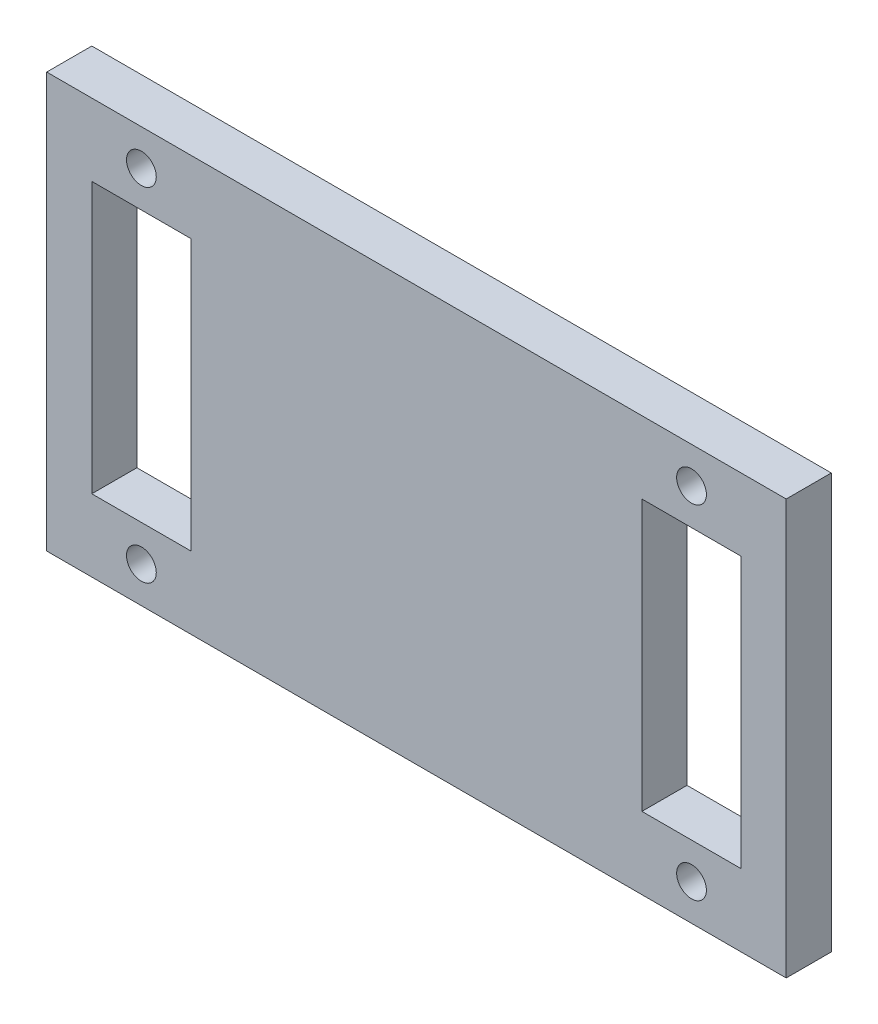
ISO-10303-21;
HEADER;
FILE_DESCRIPTION(('STEP AP214'),'2;1');
FILE_NAME('part.step','',(''),(''),'','','');
FILE_SCHEMA(('AUTOMOTIVE_DESIGN { 1 0 10303 214 1 1 1 1 }'));
ENDSEC;
DATA;
#1=APPLICATION_CONTEXT('core data for automotive mechanical design processes');
#2=APPLICATION_PROTOCOL_DEFINITION('international standard','automotive_design',2000,#1);
#3=PRODUCT_CONTEXT('',#1,'mechanical');
#4=PRODUCT('Part','Part','',(#3));
#5=PRODUCT_RELATED_PRODUCT_CATEGORY('part','',(#4));
#6=PRODUCT_DEFINITION_FORMATION('','',#4);
#7=PRODUCT_DEFINITION_CONTEXT('part definition',#1,'design');
#8=PRODUCT_DEFINITION('design','',#6,#7);
#9=PRODUCT_DEFINITION_SHAPE('','',#8);
#10=(LENGTH_UNIT() NAMED_UNIT(*) SI_UNIT(.MILLI.,.METRE.));
#11=(NAMED_UNIT(*) PLANE_ANGLE_UNIT() SI_UNIT($,.RADIAN.));
#12=(NAMED_UNIT(*) SI_UNIT($,.STERADIAN.) SOLID_ANGLE_UNIT());
#13=UNCERTAINTY_MEASURE_WITH_UNIT(LENGTH_MEASURE(1.E-05),#10,'distance_accuracy_value','');
#14=(GEOMETRIC_REPRESENTATION_CONTEXT(3) GLOBAL_UNCERTAINTY_ASSIGNED_CONTEXT((#13)) GLOBAL_UNIT_ASSIGNED_CONTEXT((#10,
#11,#12)) REPRESENTATION_CONTEXT('',''));
#15=CARTESIAN_POINT('',(0.,0.,0.));
#16=DIRECTION('',(0.,0.,1.));
#17=DIRECTION('',(1.,0.,0.));
#18=AXIS2_PLACEMENT_3D('',#15,#16,#17);
#19=CARTESIAN_POINT('',(0.,0.,5.));
#20=DIRECTION('',(0.,0.,1.));
#21=DIRECTION('',(1.,0.,0.));
#22=AXIS2_PLACEMENT_3D('',#19,#20,#21);
#23=PLANE('',#22);
#24=CARTESIAN_POINT('',(-71.4999999999936,40.9109694945555,5.));
#25=DIRECTION('',(0.,0.,1.));
#26=DIRECTION('',(1.,0.,0.));
#27=AXIS2_PLACEMENT_3D('',#24,#25,#26);
#28=CIRCLE('',#27,1.64999999999651);
#29=CARTESIAN_POINT('',(-69.8499999999972,40.9109694945555,5.));
#30=VERTEX_POINT('',#29);
#31=EDGE_CURVE('E195',#30,#30,#28,.T.);
#32=ORIENTED_EDGE('',*,*,#31,.F.);
#33=EDGE_LOOP('',(#32));
#34=FACE_BOUND('',#33,.T.);
#35=CARTESIAN_POINT('',(-10.4999999999979,40.9109694945554,5.));
#36=DIRECTION('',(0.,0.,1.));
#37=DIRECTION('',(1.,0.,0.));
#38=AXIS2_PLACEMENT_3D('',#35,#36,#37);
#39=CIRCLE('',#38,1.64999999999576);
#40=CARTESIAN_POINT('',(-8.85000000000211,40.9109694945554,5.));
#41=VERTEX_POINT('',#40);
#42=EDGE_CURVE('E207',#41,#41,#39,.T.);
#43=ORIENTED_EDGE('',*,*,#42,.F.);
#44=EDGE_LOOP('',(#43));
#45=FACE_BOUND('',#44,.T.);
#46=DIRECTION('',(0.,-1.,0.));
#47=VECTOR('',#46,1.);
#48=CARTESIAN_POINT('',(-81.9999999999916,82.9109694945566,5.));
#49=LINE('',#48,#47);
#50=CARTESIAN_POINT('',(-81.9999999999916,82.9109694945566,5.));
#51=VERTEX_POINT('',#50);
#52=CARTESIAN_POINT('',(-81.9999999999916,36.9109694945566,5.));
#53=VERTEX_POINT('',#52);
#54=EDGE_CURVE('E213',#51,#53,#49,.T.);
#55=ORIENTED_EDGE('',*,*,#54,.T.);
#56=DIRECTION('',(1.,0.,0.));
#57=VECTOR('',#56,1.);
#58=CARTESIAN_POINT('',(-81.9999999999916,36.9109694945566,5.));
#59=LINE('',#58,#57);
#60=CARTESIAN_POINT('',(0.,36.9109694945566,5.));
#61=VERTEX_POINT('',#60);
#62=EDGE_CURVE('E216',#53,#61,#59,.T.);
#63=ORIENTED_EDGE('',*,*,#62,.T.);
#64=DIRECTION('',(0.,1.,0.));
#65=VECTOR('',#64,1.);
#66=CARTESIAN_POINT('',(0.,82.9109694945566,5.));
#67=LINE('',#66,#65);
#68=CARTESIAN_POINT('',(0.,82.9109694945566,5.));
#69=VERTEX_POINT('',#68);
#70=EDGE_CURVE('E219',#61,#69,#67,.T.);
#71=ORIENTED_EDGE('',*,*,#70,.T.);
#72=DIRECTION('',(-1.,0.,0.));
#73=VECTOR('',#72,1.);
#74=CARTESIAN_POINT('',(-81.9999999999916,82.9109694945566,5.));
#75=LINE('',#74,#73);
#76=EDGE_CURVE('E221',#69,#51,#75,.T.);
#77=ORIENTED_EDGE('',*,*,#76,.T.);
#78=EDGE_LOOP('',(#55,#63,#71,#77));
#79=FACE_BOUND('',#78,.T.);
#80=CARTESIAN_POINT('',(-10.4999999999979,78.9109694945554,5.));
#81=DIRECTION('',(0.,0.,1.));
#82=DIRECTION('',(1.,0.,0.));
#83=AXIS2_PLACEMENT_3D('',#80,#81,#82);
#84=CIRCLE('',#83,1.64999999999576);
#85=CARTESIAN_POINT('',(-8.85000000000217,78.9109694945554,5.));
#86=VERTEX_POINT('',#85);
#87=EDGE_CURVE('E201',#86,#86,#84,.T.);
#88=ORIENTED_EDGE('',*,*,#87,.F.);
#89=EDGE_LOOP('',(#88));
#90=FACE_BOUND('',#89,.T.);
#91=CARTESIAN_POINT('',(-71.4999999999937,78.9109694945555,5.));
#92=DIRECTION('',(0.,0.,1.));
#93=DIRECTION('',(1.,0.,0.));
#94=AXIS2_PLACEMENT_3D('',#91,#92,#93);
#95=CIRCLE('',#94,1.6499999999965);
#96=CARTESIAN_POINT('',(-69.8499999999972,78.9109694945555,5.));
#97=VERTEX_POINT('',#96);
#98=EDGE_CURVE('E189',#97,#97,#95,.T.);
#99=ORIENTED_EDGE('',*,*,#98,.F.);
#100=EDGE_LOOP('',(#99));
#101=FACE_BOUND('',#100,.T.);
#102=DIRECTION('',(-1.,0.,0.));
#103=VECTOR('',#102,1.);
#104=CARTESIAN_POINT('',(-65.9999999999958,74.9109694945545,5.));
#105=LINE('',#104,#103);
#106=CARTESIAN_POINT('',(-65.9999999999958,74.9109694945545,5.));
#107=VERTEX_POINT('',#106);
#108=CARTESIAN_POINT('',(-76.9999999999916,74.9109694945545,5.));
#109=VERTEX_POINT('',#108);
#110=EDGE_CURVE('E160',#107,#109,#105,.T.);
#111=ORIENTED_EDGE('',*,*,#110,.F.);
#112=DIRECTION('',(0.,1.,0.));
#113=VECTOR('',#112,1.);
#114=CARTESIAN_POINT('',(-65.9999999999958,44.9109694945565,5.));
#115=LINE('',#114,#113);
#116=CARTESIAN_POINT('',(-65.9999999999958,44.9109694945565,5.));
#117=VERTEX_POINT('',#116);
#118=EDGE_CURVE('E158',#117,#107,#115,.T.);
#119=ORIENTED_EDGE('',*,*,#118,.F.);
#120=DIRECTION('',(1.,0.,0.));
#121=VECTOR('',#120,1.);
#122=CARTESIAN_POINT('',(-65.9999999999958,44.9109694945565,5.));
#123=LINE('',#122,#121);
#124=CARTESIAN_POINT('',(-76.9999999999916,44.9109694945565,5.));
#125=VERTEX_POINT('',#124);
#126=EDGE_CURVE('E166',#125,#117,#123,.T.);
#127=ORIENTED_EDGE('',*,*,#126,.F.);
#128=DIRECTION('',(0.,-1.,0.));
#129=VECTOR('',#128,1.);
#130=CARTESIAN_POINT('',(-76.9999999999916,44.9109694945565,5.));
#131=LINE('',#130,#129);
#132=EDGE_CURVE('E163',#109,#125,#131,.T.);
#133=ORIENTED_EDGE('',*,*,#132,.F.);
#134=EDGE_LOOP('',(#111,#119,#127,#133));
#135=FACE_BOUND('',#134,.T.);
#136=DIRECTION('',(1.,0.,0.));
#137=VECTOR('',#136,1.);
#138=CARTESIAN_POINT('',(-15.9999999999958,44.9109694945563,5.));
#139=LINE('',#138,#137);
#140=CARTESIAN_POINT('',(-15.9999999999958,44.9109694945563,5.));
#141=VERTEX_POINT('',#140);
#142=CARTESIAN_POINT('',(-5.00000000000003,44.9109694945563,5.));
#143=VERTEX_POINT('',#142);
#144=EDGE_CURVE('E130',#141,#143,#139,.T.);
#145=ORIENTED_EDGE('',*,*,#144,.F.);
#146=DIRECTION('',(0.,-1.,0.));
#147=VECTOR('',#146,1.);
#148=CARTESIAN_POINT('',(-15.9999999999958,44.9109694945563,5.));
#149=LINE('',#148,#147);
#150=CARTESIAN_POINT('',(-15.9999999999958,74.9109694945545,5.));
#151=VERTEX_POINT('',#150);
#152=EDGE_CURVE('E122',#151,#141,#149,.T.);
#153=ORIENTED_EDGE('',*,*,#152,.F.);
#154=DIRECTION('',(-1.,0.,0.));
#155=VECTOR('',#154,1.);
#156=CARTESIAN_POINT('',(-15.9999999999958,74.9109694945545,5.));
#157=LINE('',#156,#155);
#158=CARTESIAN_POINT('',(-5.00000000000003,74.9109694945545,5.));
#159=VERTEX_POINT('',#158);
#160=EDGE_CURVE('E144',#159,#151,#157,.T.);
#161=ORIENTED_EDGE('',*,*,#160,.F.);
#162=DIRECTION('',(0.,1.,0.));
#163=VECTOR('',#162,1.);
#164=CARTESIAN_POINT('',(-5.00000000000003,44.9109694945563,5.));
#165=LINE('',#164,#163);
#166=EDGE_CURVE('E142',#143,#159,#165,.T.);
#167=ORIENTED_EDGE('',*,*,#166,.F.);
#168=EDGE_LOOP('',(#145,#153,#161,#167));
#169=FACE_BOUND('',#168,.T.);
#170=ADVANCED_FACE('F33',(#34,#45,#79,#90,#101,#135,#169),#23,.T.);
#171=CARTESIAN_POINT('',(0.,0.,0.));
#172=DIRECTION('',(0.,0.,1.));
#173=DIRECTION('',(1.,0.,0.));
#174=AXIS2_PLACEMENT_3D('',#171,#172,#173);
#175=PLANE('',#174);
#176=DIRECTION('',(0.,1.,0.));
#177=VECTOR('',#176,1.);
#178=CARTESIAN_POINT('',(-65.9999999999958,44.9109694945565,0.));
#179=LINE('',#178,#177);
#180=CARTESIAN_POINT('',(-65.9999999999958,44.9109694945565,0.));
#181=VERTEX_POINT('',#180);
#182=CARTESIAN_POINT('',(-65.9999999999958,74.9109694945545,0.));
#183=VERTEX_POINT('',#182);
#184=EDGE_CURVE('E138',#181,#183,#179,.T.);
#185=ORIENTED_EDGE('',*,*,#184,.T.);
#186=DIRECTION('',(-1.,0.,0.));
#187=VECTOR('',#186,1.);
#188=CARTESIAN_POINT('',(-65.9999999999958,74.9109694945545,0.));
#189=LINE('',#188,#187);
#190=CARTESIAN_POINT('',(-76.9999999999916,74.9109694945545,0.));
#191=VERTEX_POINT('',#190);
#192=EDGE_CURVE('E171',#183,#191,#189,.T.);
#193=ORIENTED_EDGE('',*,*,#192,.T.);
#194=DIRECTION('',(0.,-1.,0.));
#195=VECTOR('',#194,1.);
#196=CARTESIAN_POINT('',(-76.9999999999916,44.9109694945565,0.));
#197=LINE('',#196,#195);
#198=CARTESIAN_POINT('',(-76.9999999999916,44.9109694945565,0.));
#199=VERTEX_POINT('',#198);
#200=EDGE_CURVE('E174',#191,#199,#197,.T.);
#201=ORIENTED_EDGE('',*,*,#200,.T.);
#202=DIRECTION('',(1.,0.,0.));
#203=VECTOR('',#202,1.);
#204=CARTESIAN_POINT('',(-65.9999999999958,44.9109694945565,0.));
#205=LINE('',#204,#203);
#206=EDGE_CURVE('E161',#199,#181,#205,.T.);
#207=ORIENTED_EDGE('',*,*,#206,.T.);
#208=EDGE_LOOP('',(#185,#193,#201,#207));
#209=FACE_BOUND('',#208,.T.);
#210=DIRECTION('',(0.,-1.,0.));
#211=VECTOR('',#210,1.);
#212=CARTESIAN_POINT('',(-81.9999999999916,82.9109694945566,0.));
#213=LINE('',#212,#211);
#214=CARTESIAN_POINT('',(-81.9999999999916,82.9109694945566,0.));
#215=VERTEX_POINT('',#214);
#216=CARTESIAN_POINT('',(-81.9999999999916,36.9109694945566,0.));
#217=VERTEX_POINT('',#216);
#218=EDGE_CURVE('E210',#215,#217,#213,.T.);
#219=ORIENTED_EDGE('',*,*,#218,.F.);
#220=DIRECTION('',(-1.,0.,0.));
#221=VECTOR('',#220,1.);
#222=CARTESIAN_POINT('',(-81.9999999999916,82.9109694945566,0.));
#223=LINE('',#222,#221);
#224=CARTESIAN_POINT('',(0.,82.9109694945566,0.));
#225=VERTEX_POINT('',#224);
#226=EDGE_CURVE('E217',#225,#215,#223,.T.);
#227=ORIENTED_EDGE('',*,*,#226,.F.);
#228=DIRECTION('',(0.,1.,0.));
#229=VECTOR('',#228,1.);
#230=CARTESIAN_POINT('',(0.,82.9109694945566,0.));
#231=LINE('',#230,#229);
#232=CARTESIAN_POINT('',(0.,36.9109694945566,0.));
#233=VERTEX_POINT('',#232);
#234=EDGE_CURVE('E228',#233,#225,#231,.T.);
#235=ORIENTED_EDGE('',*,*,#234,.F.);
#236=DIRECTION('',(1.,0.,0.));
#237=VECTOR('',#236,1.);
#238=CARTESIAN_POINT('',(-81.9999999999916,36.9109694945566,0.));
#239=LINE('',#238,#237);
#240=EDGE_CURVE('E226',#217,#233,#239,.T.);
#241=ORIENTED_EDGE('',*,*,#240,.F.);
#242=EDGE_LOOP('',(#219,#227,#235,#241));
#243=FACE_BOUND('',#242,.T.);
#244=CARTESIAN_POINT('',(-10.4999999999979,40.9109694945554,0.));
#245=DIRECTION('',(0.,0.,1.));
#246=DIRECTION('',(1.,0.,0.));
#247=AXIS2_PLACEMENT_3D('',#244,#245,#246);
#248=CIRCLE('',#247,1.64999999999576);
#249=CARTESIAN_POINT('',(-8.85000000000211,40.9109694945554,0.));
#250=VERTEX_POINT('',#249);
#251=EDGE_CURVE('E204',#250,#250,#248,.T.);
#252=ORIENTED_EDGE('',*,*,#251,.T.);
#253=EDGE_LOOP('',(#252));
#254=FACE_BOUND('',#253,.T.);
#255=CARTESIAN_POINT('',(-10.4999999999979,78.9109694945554,0.));
#256=DIRECTION('',(0.,0.,1.));
#257=DIRECTION('',(1.,0.,0.));
#258=AXIS2_PLACEMENT_3D('',#255,#256,#257);
#259=CIRCLE('',#258,1.64999999999576);
#260=CARTESIAN_POINT('',(-8.85000000000217,78.9109694945554,0.));
#261=VERTEX_POINT('',#260);
#262=EDGE_CURVE('E198',#261,#261,#259,.T.);
#263=ORIENTED_EDGE('',*,*,#262,.T.);
#264=EDGE_LOOP('',(#263));
#265=FACE_BOUND('',#264,.T.);
#266=CARTESIAN_POINT('',(-71.4999999999936,40.9109694945555,0.));
#267=DIRECTION('',(0.,0.,1.));
#268=DIRECTION('',(1.,0.,0.));
#269=AXIS2_PLACEMENT_3D('',#266,#267,#268);
#270=CIRCLE('',#269,1.64999999999651);
#271=CARTESIAN_POINT('',(-69.8499999999972,40.9109694945555,0.));
#272=VERTEX_POINT('',#271);
#273=EDGE_CURVE('E192',#272,#272,#270,.T.);
#274=ORIENTED_EDGE('',*,*,#273,.T.);
#275=EDGE_LOOP('',(#274));
#276=FACE_BOUND('',#275,.T.);
#277=CARTESIAN_POINT('',(-71.4999999999937,78.9109694945555,0.));
#278=DIRECTION('',(0.,0.,1.));
#279=DIRECTION('',(1.,0.,0.));
#280=AXIS2_PLACEMENT_3D('',#277,#278,#279);
#281=CIRCLE('',#280,1.6499999999965);
#282=CARTESIAN_POINT('',(-69.8499999999972,78.9109694945555,0.));
#283=VERTEX_POINT('',#282);
#284=EDGE_CURVE('E188',#283,#283,#281,.T.);
#285=ORIENTED_EDGE('',*,*,#284,.T.);
#286=EDGE_LOOP('',(#285));
#287=FACE_BOUND('',#286,.T.);
#288=DIRECTION('',(0.,-1.,0.));
#289=VECTOR('',#288,1.);
#290=CARTESIAN_POINT('',(-15.9999999999958,44.9109694945563,0.));
#291=LINE('',#290,#289);
#292=CARTESIAN_POINT('',(-15.9999999999958,74.9109694945545,0.));
#293=VERTEX_POINT('',#292);
#294=CARTESIAN_POINT('',(-15.9999999999958,44.9109694945563,0.));
#295=VERTEX_POINT('',#294);
#296=EDGE_CURVE('E56',#293,#295,#291,.T.);
#297=ORIENTED_EDGE('',*,*,#296,.T.);
#298=DIRECTION('',(1.,0.,0.));
#299=VECTOR('',#298,1.);
#300=CARTESIAN_POINT('',(-15.9999999999958,44.9109694945563,0.));
#301=LINE('',#300,#299);
#302=CARTESIAN_POINT('',(-5.00000000000003,44.9109694945563,0.));
#303=VERTEX_POINT('',#302);
#304=EDGE_CURVE('E137',#295,#303,#301,.T.);
#305=ORIENTED_EDGE('',*,*,#304,.T.);
#306=DIRECTION('',(0.,1.,0.));
#307=VECTOR('',#306,1.);
#308=CARTESIAN_POINT('',(-5.00000000000003,44.9109694945563,0.));
#309=LINE('',#308,#307);
#310=CARTESIAN_POINT('',(-5.00000000000003,74.9109694945545,0.));
#311=VERTEX_POINT('',#310);
#312=EDGE_CURVE('E150',#303,#311,#309,.T.);
#313=ORIENTED_EDGE('',*,*,#312,.T.);
#314=DIRECTION('',(-1.,0.,0.));
#315=VECTOR('',#314,1.);
#316=CARTESIAN_POINT('',(-15.9999999999958,74.9109694945545,0.));
#317=LINE('',#316,#315);
#318=EDGE_CURVE('E131',#311,#293,#317,.T.);
#319=ORIENTED_EDGE('',*,*,#318,.T.);
#320=EDGE_LOOP('',(#297,#305,#313,#319));
#321=FACE_BOUND('',#320,.T.);
#322=ADVANCED_FACE('F246',(#209,#243,#254,#265,#276,#287,#321),#175,.F.);
#323=CARTESIAN_POINT('',(-81.9999999999916,82.9109694945566,5.));
#324=DIRECTION('',(1.,0.,0.));
#325=DIRECTION('',(0.,0.,-1.));
#326=AXIS2_PLACEMENT_3D('',#323,#324,#325);
#327=PLANE('',#326);
#328=ORIENTED_EDGE('',*,*,#218,.T.);
#329=DIRECTION('',(0.,0.,-1.));
#330=VECTOR('',#329,1.);
#331=CARTESIAN_POINT('',(-81.9999999999916,36.9109694945566,5.));
#332=LINE('',#331,#330);
#333=EDGE_CURVE('E11',#53,#217,#332,.T.);
#334=ORIENTED_EDGE('',*,*,#333,.F.);
#335=ORIENTED_EDGE('',*,*,#54,.F.);
#336=DIRECTION('',(0.,0.,-1.));
#337=VECTOR('',#336,1.);
#338=CARTESIAN_POINT('',(-81.9999999999916,82.9109694945566,5.));
#339=LINE('',#338,#337);
#340=EDGE_CURVE('E223',#51,#215,#339,.T.);
#341=ORIENTED_EDGE('',*,*,#340,.T.);
#342=EDGE_LOOP('',(#328,#334,#335,#341));
#343=FACE_BOUND('',#342,.T.);
#344=ADVANCED_FACE('F35',(#343),#327,.F.);
#345=CARTESIAN_POINT('',(-81.9999999999916,36.9109694945566,5.));
#346=DIRECTION('',(0.,1.,0.));
#347=DIRECTION('',(0.,0.,1.));
#348=AXIS2_PLACEMENT_3D('',#345,#346,#347);
#349=PLANE('',#348);
#350=ORIENTED_EDGE('',*,*,#240,.T.);
#351=DIRECTION('',(0.,0.,-1.));
#352=VECTOR('',#351,1.);
#353=CARTESIAN_POINT('',(0.,36.9109694945566,5.));
#354=LINE('',#353,#352);
#355=EDGE_CURVE('E41',#61,#233,#354,.T.);
#356=ORIENTED_EDGE('',*,*,#355,.F.);
#357=ORIENTED_EDGE('',*,*,#62,.F.);
#358=ORIENTED_EDGE('',*,*,#333,.T.);
#359=EDGE_LOOP('',(#350,#356,#357,#358));
#360=FACE_BOUND('',#359,.T.);
#361=ADVANCED_FACE('F257',(#360),#349,.F.);
#362=CARTESIAN_POINT('',(0.,82.9109694945566,5.));
#363=DIRECTION('',(-1.,0.,0.));
#364=DIRECTION('',(0.,0.,1.));
#365=AXIS2_PLACEMENT_3D('',#362,#363,#364);
#366=PLANE('',#365);
#367=ORIENTED_EDGE('',*,*,#234,.T.);
#368=DIRECTION('',(0.,0.,-1.));
#369=VECTOR('',#368,1.);
#370=CARTESIAN_POINT('',(0.,82.9109694945566,5.));
#371=LINE('',#370,#369);
#372=EDGE_CURVE('E233',#69,#225,#371,.T.);
#373=ORIENTED_EDGE('',*,*,#372,.F.);
#374=ORIENTED_EDGE('',*,*,#70,.F.);
#375=ORIENTED_EDGE('',*,*,#355,.T.);
#376=EDGE_LOOP('',(#367,#373,#374,#375));
#377=FACE_BOUND('',#376,.T.);
#378=ADVANCED_FACE('F240',(#377),#366,.F.);
#379=CARTESIAN_POINT('',(-81.9999999999916,82.9109694945566,5.));
#380=DIRECTION('',(0.,-1.,0.));
#381=DIRECTION('',(0.,0.,-1.));
#382=AXIS2_PLACEMENT_3D('',#379,#380,#381);
#383=PLANE('',#382);
#384=ORIENTED_EDGE('',*,*,#226,.T.);
#385=ORIENTED_EDGE('',*,*,#340,.F.);
#386=ORIENTED_EDGE('',*,*,#76,.F.);
#387=ORIENTED_EDGE('',*,*,#372,.T.);
#388=EDGE_LOOP('',(#384,#385,#386,#387));
#389=FACE_BOUND('',#388,.T.);
#390=ADVANCED_FACE('F250',(#389),#383,.F.);
#391=CARTESIAN_POINT('',(-10.4999999999979,40.9109694945554,5.));
#392=DIRECTION('',(0.,0.,-1.));
#393=DIRECTION('',(-1.,0.,0.));
#394=AXIS2_PLACEMENT_3D('',#391,#392,#393);
#395=CYLINDRICAL_SURFACE('',#394,1.64999999999576);
#396=ORIENTED_EDGE('',*,*,#42,.T.);
#397=EDGE_LOOP('',(#396));
#398=FACE_BOUND('',#397,.T.);
#399=ORIENTED_EDGE('',*,*,#251,.F.);
#400=EDGE_LOOP('',(#399));
#401=FACE_BOUND('',#400,.T.);
#402=ADVANCED_FACE('F275',(#398,#401),#395,.F.);
#403=CARTESIAN_POINT('',(-10.4999999999979,78.9109694945554,5.));
#404=DIRECTION('',(0.,0.,-1.));
#405=DIRECTION('',(-1.,0.,0.));
#406=AXIS2_PLACEMENT_3D('',#403,#404,#405);
#407=CYLINDRICAL_SURFACE('',#406,1.64999999999576);
#408=ORIENTED_EDGE('',*,*,#87,.T.);
#409=EDGE_LOOP('',(#408));
#410=FACE_BOUND('',#409,.T.);
#411=ORIENTED_EDGE('',*,*,#262,.F.);
#412=EDGE_LOOP('',(#411));
#413=FACE_BOUND('',#412,.T.);
#414=ADVANCED_FACE('F282',(#410,#413),#407,.F.);
#415=CARTESIAN_POINT('',(-71.4999999999936,40.9109694945555,5.));
#416=DIRECTION('',(0.,0.,-1.));
#417=DIRECTION('',(-1.,0.,0.));
#418=AXIS2_PLACEMENT_3D('',#415,#416,#417);
#419=CYLINDRICAL_SURFACE('',#418,1.64999999999651);
#420=ORIENTED_EDGE('',*,*,#31,.T.);
#421=EDGE_LOOP('',(#420));
#422=FACE_BOUND('',#421,.T.);
#423=ORIENTED_EDGE('',*,*,#273,.F.);
#424=EDGE_LOOP('',(#423));
#425=FACE_BOUND('',#424,.T.);
#426=ADVANCED_FACE('F287',(#422,#425),#419,.F.);
#427=CARTESIAN_POINT('',(-71.4999999999937,78.9109694945555,5.));
#428=DIRECTION('',(0.,0.,-1.));
#429=DIRECTION('',(-1.,0.,0.));
#430=AXIS2_PLACEMENT_3D('',#427,#428,#429);
#431=CYLINDRICAL_SURFACE('',#430,1.6499999999965);
#432=ORIENTED_EDGE('',*,*,#98,.T.);
#433=EDGE_LOOP('',(#432));
#434=FACE_BOUND('',#433,.T.);
#435=ORIENTED_EDGE('',*,*,#284,.F.);
#436=EDGE_LOOP('',(#435));
#437=FACE_BOUND('',#436,.T.);
#438=ADVANCED_FACE('F329',(#434,#437),#431,.F.);
#439=CARTESIAN_POINT('',(-65.9999999999958,44.9109694945565,5.));
#440=DIRECTION('',(-1.,0.,0.));
#441=DIRECTION('',(0.,0.,1.));
#442=AXIS2_PLACEMENT_3D('',#439,#440,#441);
#443=PLANE('',#442);
#444=ORIENTED_EDGE('',*,*,#184,.F.);
#445=DIRECTION('',(0.,0.,-1.));
#446=VECTOR('',#445,1.);
#447=CARTESIAN_POINT('',(-65.9999999999958,44.9109694945565,5.));
#448=LINE('',#447,#446);
#449=EDGE_CURVE('E168',#117,#181,#448,.T.);
#450=ORIENTED_EDGE('',*,*,#449,.F.);
#451=ORIENTED_EDGE('',*,*,#118,.T.);
#452=DIRECTION('',(0.,0.,-1.));
#453=VECTOR('',#452,1.);
#454=CARTESIAN_POINT('',(-65.9999999999958,74.9109694945545,5.));
#455=LINE('',#454,#453);
#456=EDGE_CURVE('E185',#107,#183,#455,.T.);
#457=ORIENTED_EDGE('',*,*,#456,.T.);
#458=EDGE_LOOP('',(#444,#450,#451,#457));
#459=FACE_BOUND('',#458,.T.);
#460=ADVANCED_FACE('F325',(#459),#443,.T.);
#461=CARTESIAN_POINT('',(-65.9999999999958,74.9109694945545,5.));
#462=DIRECTION('',(0.,-1.,0.));
#463=DIRECTION('',(0.,0.,-1.));
#464=AXIS2_PLACEMENT_3D('',#461,#462,#463);
#465=PLANE('',#464);
#466=ORIENTED_EDGE('',*,*,#192,.F.);
#467=ORIENTED_EDGE('',*,*,#456,.F.);
#468=ORIENTED_EDGE('',*,*,#110,.T.);
#469=DIRECTION('',(0.,0.,-1.));
#470=VECTOR('',#469,1.);
#471=CARTESIAN_POINT('',(-76.9999999999916,74.9109694945545,5.));
#472=LINE('',#471,#470);
#473=EDGE_CURVE('E183',#109,#191,#472,.T.);
#474=ORIENTED_EDGE('',*,*,#473,.T.);
#475=EDGE_LOOP('',(#466,#467,#468,#474));
#476=FACE_BOUND('',#475,.T.);
#477=ADVANCED_FACE('F321',(#476),#465,.T.);
#478=CARTESIAN_POINT('',(-76.9999999999916,44.9109694945565,5.));
#479=DIRECTION('',(1.,0.,0.));
#480=DIRECTION('',(0.,0.,-1.));
#481=AXIS2_PLACEMENT_3D('',#478,#479,#480);
#482=PLANE('',#481);
#483=ORIENTED_EDGE('',*,*,#200,.F.);
#484=ORIENTED_EDGE('',*,*,#473,.F.);
#485=ORIENTED_EDGE('',*,*,#132,.T.);
#486=DIRECTION('',(0.,0.,-1.));
#487=VECTOR('',#486,1.);
#488=CARTESIAN_POINT('',(-76.9999999999916,44.9109694945565,5.));
#489=LINE('',#488,#487);
#490=EDGE_CURVE('E181',#125,#199,#489,.T.);
#491=ORIENTED_EDGE('',*,*,#490,.T.);
#492=EDGE_LOOP('',(#483,#484,#485,#491));
#493=FACE_BOUND('',#492,.T.);
#494=ADVANCED_FACE('F317',(#493),#482,.T.);
#495=CARTESIAN_POINT('',(-65.9999999999958,44.9109694945565,5.));
#496=DIRECTION('',(0.,1.,0.));
#497=DIRECTION('',(0.,0.,1.));
#498=AXIS2_PLACEMENT_3D('',#495,#496,#497);
#499=PLANE('',#498);
#500=ORIENTED_EDGE('',*,*,#206,.F.);
#501=ORIENTED_EDGE('',*,*,#490,.F.);
#502=ORIENTED_EDGE('',*,*,#126,.T.);
#503=ORIENTED_EDGE('',*,*,#449,.T.);
#504=EDGE_LOOP('',(#500,#501,#502,#503));
#505=FACE_BOUND('',#504,.T.);
#506=ADVANCED_FACE('F314',(#505),#499,.T.);
#507=CARTESIAN_POINT('',(-15.9999999999958,44.9109694945563,5.));
#508=DIRECTION('',(1.,0.,0.));
#509=DIRECTION('',(0.,0.,-1.));
#510=AXIS2_PLACEMENT_3D('',#507,#508,#509);
#511=PLANE('',#510);
#512=ORIENTED_EDGE('',*,*,#296,.F.);
#513=DIRECTION('',(0.,0.,-1.));
#514=VECTOR('',#513,1.);
#515=CARTESIAN_POINT('',(-15.9999999999958,74.9109694945545,5.));
#516=LINE('',#515,#514);
#517=EDGE_CURVE('E126',#151,#293,#516,.T.);
#518=ORIENTED_EDGE('',*,*,#517,.F.);
#519=ORIENTED_EDGE('',*,*,#152,.T.);
#520=DIRECTION('',(0.,0.,-1.));
#521=VECTOR('',#520,1.);
#522=CARTESIAN_POINT('',(-15.9999999999958,44.9109694945563,5.));
#523=LINE('',#522,#521);
#524=EDGE_CURVE('E125',#141,#295,#523,.T.);
#525=ORIENTED_EDGE('',*,*,#524,.T.);
#526=EDGE_LOOP('',(#512,#518,#519,#525));
#527=FACE_BOUND('',#526,.T.);
#528=ADVANCED_FACE('F124',(#527),#511,.T.);
#529=CARTESIAN_POINT('',(-15.9999999999958,44.9109694945563,5.));
#530=DIRECTION('',(0.,1.,0.));
#531=DIRECTION('',(0.,0.,1.));
#532=AXIS2_PLACEMENT_3D('',#529,#530,#531);
#533=PLANE('',#532);
#534=ORIENTED_EDGE('',*,*,#304,.F.);
#535=ORIENTED_EDGE('',*,*,#524,.F.);
#536=ORIENTED_EDGE('',*,*,#144,.T.);
#537=DIRECTION('',(0.,0.,-1.));
#538=VECTOR('',#537,1.);
#539=CARTESIAN_POINT('',(-5.00000000000003,44.9109694945563,5.));
#540=LINE('',#539,#538);
#541=EDGE_CURVE('E139',#143,#303,#540,.T.);
#542=ORIENTED_EDGE('',*,*,#541,.T.);
#543=EDGE_LOOP('',(#534,#535,#536,#542));
#544=FACE_BOUND('',#543,.T.);
#545=ADVANCED_FACE('F134',(#544),#533,.T.);
#546=CARTESIAN_POINT('',(-5.00000000000003,44.9109694945563,5.));
#547=DIRECTION('',(-1.,0.,0.));
#548=DIRECTION('',(0.,0.,1.));
#549=AXIS2_PLACEMENT_3D('',#546,#547,#548);
#550=PLANE('',#549);
#551=ORIENTED_EDGE('',*,*,#312,.F.);
#552=ORIENTED_EDGE('',*,*,#541,.F.);
#553=ORIENTED_EDGE('',*,*,#166,.T.);
#554=DIRECTION('',(0.,0.,-1.));
#555=VECTOR('',#554,1.);
#556=CARTESIAN_POINT('',(-5.00000000000003,74.9109694945545,5.));
#557=LINE('',#556,#555);
#558=EDGE_CURVE('E48',#159,#311,#557,.T.);
#559=ORIENTED_EDGE('',*,*,#558,.T.);
#560=EDGE_LOOP('',(#551,#552,#553,#559));
#561=FACE_BOUND('',#560,.T.);
#562=ADVANCED_FACE('F302',(#561),#550,.T.);
#563=CARTESIAN_POINT('',(-15.9999999999958,74.9109694945545,5.));
#564=DIRECTION('',(0.,-1.,0.));
#565=DIRECTION('',(0.,0.,-1.));
#566=AXIS2_PLACEMENT_3D('',#563,#564,#565);
#567=PLANE('',#566);
#568=ORIENTED_EDGE('',*,*,#318,.F.);
#569=ORIENTED_EDGE('',*,*,#558,.F.);
#570=ORIENTED_EDGE('',*,*,#160,.T.);
#571=ORIENTED_EDGE('',*,*,#517,.T.);
#572=EDGE_LOOP('',(#568,#569,#570,#571));
#573=FACE_BOUND('',#572,.T.);
#574=ADVANCED_FACE('F300',(#573),#567,.T.);
#575=CLOSED_SHELL('',(#170,#322,#344,#361,#378,#390,#402,#414,#426,#438,#460,#477,#494,#506,
#528,#545,#562,#574));
#576=MANIFOLD_SOLID_BREP('B2',#575);
#577=ADVANCED_BREP_SHAPE_REPRESENTATION('',(#18,#576),#14);
#578=SHAPE_DEFINITION_REPRESENTATION(#9,#577);
ENDSEC;
END-ISO-10303-21;
